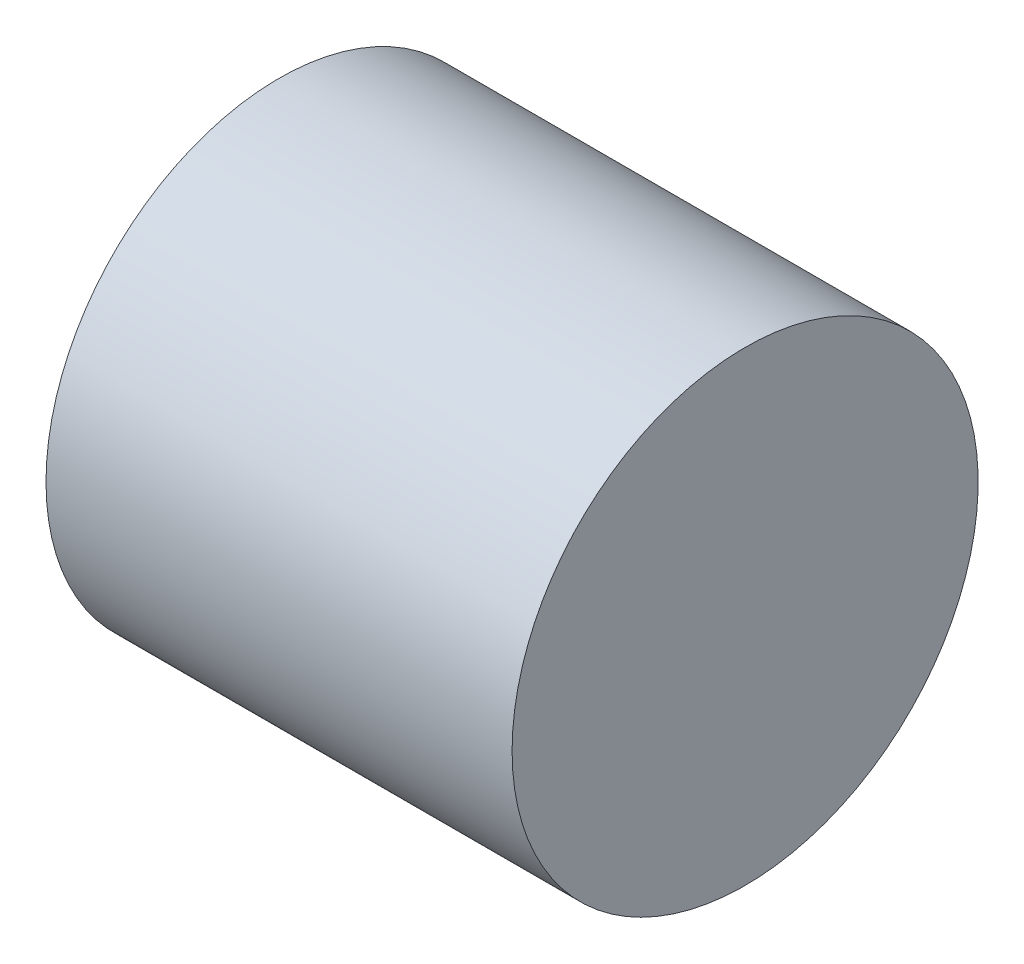
ISO-10303-21;
HEADER;
FILE_DESCRIPTION(('STEP AP214'),'2;1');
FILE_NAME('part.step','',(''),(''),'','','');
FILE_SCHEMA(('AUTOMOTIVE_DESIGN { 1 0 10303 214 1 1 1 1 }'));
ENDSEC;
DATA;
#1=APPLICATION_CONTEXT('core data for automotive mechanical design processes');
#2=APPLICATION_PROTOCOL_DEFINITION('international standard','automotive_design',2000,#1);
#3=PRODUCT_CONTEXT('',#1,'mechanical');
#4=PRODUCT('Part','Part','',(#3));
#5=PRODUCT_RELATED_PRODUCT_CATEGORY('part','',(#4));
#6=PRODUCT_DEFINITION_FORMATION('','',#4);
#7=PRODUCT_DEFINITION_CONTEXT('part definition',#1,'design');
#8=PRODUCT_DEFINITION('design','',#6,#7);
#9=PRODUCT_DEFINITION_SHAPE('','',#8);
#10=(LENGTH_UNIT() NAMED_UNIT(*) SI_UNIT(.MILLI.,.METRE.));
#11=(NAMED_UNIT(*) PLANE_ANGLE_UNIT() SI_UNIT($,.RADIAN.));
#12=(NAMED_UNIT(*) SI_UNIT($,.STERADIAN.) SOLID_ANGLE_UNIT());
#13=UNCERTAINTY_MEASURE_WITH_UNIT(LENGTH_MEASURE(1.E-05),#10,'distance_accuracy_value','');
#14=(GEOMETRIC_REPRESENTATION_CONTEXT(3) GLOBAL_UNCERTAINTY_ASSIGNED_CONTEXT((#13)) GLOBAL_UNIT_ASSIGNED_CONTEXT((#10,
#11,#12)) REPRESENTATION_CONTEXT('',''));
#15=CARTESIAN_POINT('',(0.,0.,0.));
#16=DIRECTION('',(0.,0.,1.));
#17=DIRECTION('',(1.,0.,0.));
#18=AXIS2_PLACEMENT_3D('',#15,#16,#17);
#19=CARTESIAN_POINT('',(95.,0.,0.));
#20=DIRECTION('',(1.,0.,0.));
#21=DIRECTION('',(0.,0.,-1.));
#22=AXIS2_PLACEMENT_3D('',#19,#20,#21);
#23=PLANE('',#22);
#24=CARTESIAN_POINT('',(95.,0.,0.));
#25=DIRECTION('',(-1.,0.,0.));
#26=DIRECTION('',(0.,0.,1.));
#27=AXIS2_PLACEMENT_3D('',#24,#25,#26);
#28=CIRCLE('',#27,47.5);
#29=CARTESIAN_POINT('',(95.,0.,47.5));
#30=VERTEX_POINT('',#29);
#31=EDGE_CURVE('E18',#30,#30,#28,.T.);
#32=ORIENTED_EDGE('',*,*,#31,.F.);
#33=EDGE_LOOP('',(#32));
#34=FACE_BOUND('',#33,.T.);
#35=ADVANCED_FACE('F15',(#34),#23,.T.);
#36=CARTESIAN_POINT('',(0.,0.,0.));
#37=DIRECTION('',(1.,0.,0.));
#38=DIRECTION('',(0.,0.,-1.));
#39=AXIS2_PLACEMENT_3D('',#36,#37,#38);
#40=PLANE('',#39);
#41=CARTESIAN_POINT('',(0.,0.,0.));
#42=DIRECTION('',(-1.,0.,0.));
#43=DIRECTION('',(0.,0.,1.));
#44=AXIS2_PLACEMENT_3D('',#41,#42,#43);
#45=CIRCLE('',#44,47.5);
#46=CARTESIAN_POINT('',(0.,0.,47.5));
#47=VERTEX_POINT('',#46);
#48=EDGE_CURVE('E10',#47,#47,#45,.F.);
#49=ORIENTED_EDGE('',*,*,#48,.F.);
#50=EDGE_LOOP('',(#49));
#51=FACE_BOUND('',#50,.T.);
#52=ADVANCED_FACE('F30',(#51),#40,.F.);
#53=CARTESIAN_POINT('',(95.,0.,0.));
#54=DIRECTION('',(-1.,0.,0.));
#55=DIRECTION('',(0.,0.,1.));
#56=AXIS2_PLACEMENT_3D('',#53,#54,#55);
#57=CYLINDRICAL_SURFACE('',#56,47.5);
#58=ORIENTED_EDGE('',*,*,#48,.T.);
#59=EDGE_LOOP('',(#58));
#60=FACE_BOUND('',#59,.T.);
#61=ORIENTED_EDGE('',*,*,#31,.T.);
#62=EDGE_LOOP('',(#61));
#63=FACE_BOUND('',#62,.T.);
#64=ADVANCED_FACE('F27',(#60,#63),#57,.T.);
#65=CLOSED_SHELL('',(#35,#52,#64));
#66=MANIFOLD_SOLID_BREP('B1',#65);
#67=ADVANCED_BREP_SHAPE_REPRESENTATION('',(#18,#66),#14);
#68=SHAPE_DEFINITION_REPRESENTATION(#9,#67);
ENDSEC;
END-ISO-10303-21;
